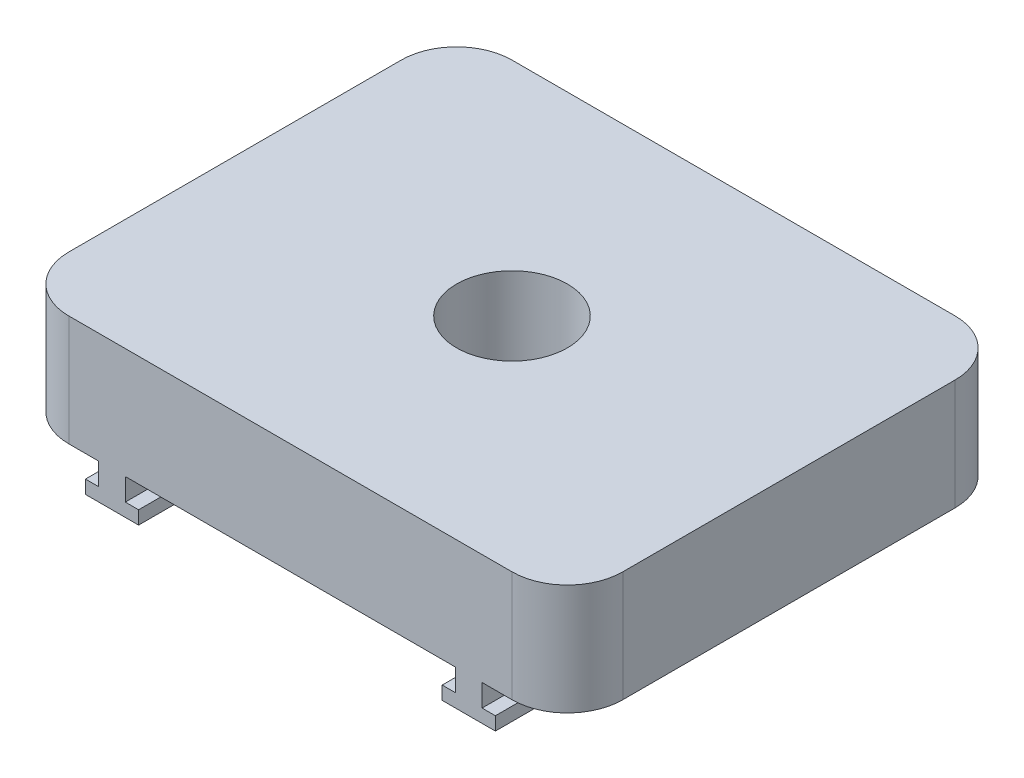
ISO-10303-21;
HEADER;
FILE_DESCRIPTION(('STEP AP214'),'2;1');
FILE_NAME('part.step','',(''),(''),'','','');
FILE_SCHEMA(('AUTOMOTIVE_DESIGN { 1 0 10303 214 1 1 1 1 }'));
ENDSEC;
DATA;
#1=APPLICATION_CONTEXT('core data for automotive mechanical design processes');
#2=APPLICATION_PROTOCOL_DEFINITION('international standard','automotive_design',2000,#1);
#3=PRODUCT_CONTEXT('',#1,'mechanical');
#4=PRODUCT('Part','Part','',(#3));
#5=PRODUCT_RELATED_PRODUCT_CATEGORY('part','',(#4));
#6=PRODUCT_DEFINITION_FORMATION('','',#4);
#7=PRODUCT_DEFINITION_CONTEXT('part definition',#1,'design');
#8=PRODUCT_DEFINITION('design','',#6,#7);
#9=PRODUCT_DEFINITION_SHAPE('','',#8);
#10=(LENGTH_UNIT() NAMED_UNIT(*) SI_UNIT(.MILLI.,.METRE.));
#11=(NAMED_UNIT(*) PLANE_ANGLE_UNIT() SI_UNIT($,.RADIAN.));
#12=(NAMED_UNIT(*) SI_UNIT($,.STERADIAN.) SOLID_ANGLE_UNIT());
#13=UNCERTAINTY_MEASURE_WITH_UNIT(LENGTH_MEASURE(1.E-05),#10,'distance_accuracy_value','');
#14=(GEOMETRIC_REPRESENTATION_CONTEXT(3) GLOBAL_UNCERTAINTY_ASSIGNED_CONTEXT((#13)) GLOBAL_UNIT_ASSIGNED_CONTEXT((#10,
#11,#12)) REPRESENTATION_CONTEXT('',''));
#15=CARTESIAN_POINT('',(0.,0.,0.));
#16=DIRECTION('',(0.,0.,1.));
#17=DIRECTION('',(1.,0.,0.));
#18=AXIS2_PLACEMENT_3D('',#15,#16,#17);
#19=CARTESIAN_POINT('',(0.,-82.,0.));
#20=DIRECTION('',(0.,-1.,0.));
#21=DIRECTION('',(0.,0.,-1.));
#22=AXIS2_PLACEMENT_3D('',#19,#20,#21);
#23=PLANE('',#22);
#24=DIRECTION('',(0.,0.,-1.));
#25=VECTOR('',#24,1.);
#26=CARTESIAN_POINT('',(137.,-82.,200.));
#27=LINE('',#26,#25);
#28=CARTESIAN_POINT('',(137.,-82.,200.));
#29=VERTEX_POINT('',#28);
#30=CARTESIAN_POINT('',(137.,-82.,-200.));
#31=VERTEX_POINT('',#30);
#32=EDGE_CURVE('E194',#29,#31,#27,.T.);
#33=ORIENTED_EDGE('',*,*,#32,.T.);
#34=DIRECTION('',(1.,0.,0.));
#35=VECTOR('',#34,1.);
#36=CARTESIAN_POINT('',(-185.,-82.,-200.));
#37=LINE('',#36,#35);
#38=CARTESIAN_POINT('',(185.,-82.,-200.));
#39=VERTEX_POINT('',#38);
#40=EDGE_CURVE('E322',#31,#39,#37,.T.);
#41=ORIENTED_EDGE('',*,*,#40,.T.);
#42=DIRECTION('',(0.,0.,1.));
#43=VECTOR('',#42,1.);
#44=CARTESIAN_POINT('',(185.,-82.,-200.));
#45=LINE('',#44,#43);
#46=CARTESIAN_POINT('',(185.,-82.,200.));
#47=VERTEX_POINT('',#46);
#48=EDGE_CURVE('E219',#39,#47,#45,.T.);
#49=ORIENTED_EDGE('',*,*,#48,.T.);
#50=DIRECTION('',(-1.,0.,0.));
#51=VECTOR('',#50,1.);
#52=CARTESIAN_POINT('',(185.,-82.,200.));
#53=LINE('',#52,#51);
#54=EDGE_CURVE('E211',#47,#29,#53,.T.);
#55=ORIENTED_EDGE('',*,*,#54,.T.);
#56=EDGE_LOOP('',(#33,#41,#49,#55));
#57=FACE_BOUND('',#56,.T.);
#58=ADVANCED_FACE('F33',(#57),#23,.T.);
#59=CARTESIAN_POINT('',(173.,50.,-200.));
#60=DIRECTION('',(-1.,0.,0.));
#61=DIRECTION('',(0.,-1.,0.));
#62=AXIS2_PLACEMENT_3D('',#59,#60,#61);
#63=PLANE('',#62);
#64=DIRECTION('',(0.,0.,-1.));
#65=VECTOR('',#64,1.);
#66=CARTESIAN_POINT('',(173.,-50.,-200.));
#67=LINE('',#66,#65);
#68=CARTESIAN_POINT('',(173.,-50.,200.));
#69=VERTEX_POINT('',#68);
#70=CARTESIAN_POINT('',(173.,-50.,-200.));
#71=VERTEX_POINT('',#70);
#72=EDGE_CURVE('E355',#69,#71,#67,.T.);
#73=ORIENTED_EDGE('',*,*,#72,.F.);
#74=DIRECTION('',(0.,-1.,0.));
#75=VECTOR('',#74,1.);
#76=CARTESIAN_POINT('',(173.,50.,200.));
#77=LINE('',#76,#75);
#78=CARTESIAN_POINT('',(173.,-69.999999988,200.));
#79=VERTEX_POINT('',#78);
#80=EDGE_CURVE('E338',#69,#79,#77,.T.);
#81=ORIENTED_EDGE('',*,*,#80,.T.);
#82=DIRECTION('',(0.,0.,1.));
#83=VECTOR('',#82,1.);
#84=CARTESIAN_POINT('',(173.,-69.999999988,-200.));
#85=LINE('',#84,#83);
#86=CARTESIAN_POINT('',(173.,-69.999999988,-200.));
#87=VERTEX_POINT('',#86);
#88=EDGE_CURVE('E348',#87,#79,#85,.T.);
#89=ORIENTED_EDGE('',*,*,#88,.F.);
#90=DIRECTION('',(0.,-1.,0.));
#91=VECTOR('',#90,1.);
#92=CARTESIAN_POINT('',(173.,50.,-200.));
#93=LINE('',#92,#91);
#94=EDGE_CURVE('E341',#71,#87,#93,.T.);
#95=ORIENTED_EDGE('',*,*,#94,.F.);
#96=EDGE_LOOP('',(#73,#81,#89,#95));
#97=FACE_BOUND('',#96,.T.);
#98=ADVANCED_FACE('F474',(#97),#63,.F.);
#99=CARTESIAN_POINT('',(-173.,-69.999999988,-200.));
#100=DIRECTION('',(1.,0.,0.));
#101=DIRECTION('',(0.,1.,0.));
#102=AXIS2_PLACEMENT_3D('',#99,#100,#101);
#103=PLANE('',#102);
#104=DIRECTION('',(0.,0.,1.));
#105=VECTOR('',#104,1.);
#106=CARTESIAN_POINT('',(-173.,-50.,200.));
#107=LINE('',#106,#105);
#108=CARTESIAN_POINT('',(-173.,-50.,-200.));
#109=VERTEX_POINT('',#108);
#110=CARTESIAN_POINT('',(-173.,-50.,200.));
#111=VERTEX_POINT('',#110);
#112=EDGE_CURVE('E301',#109,#111,#107,.T.);
#113=ORIENTED_EDGE('',*,*,#112,.F.);
#114=DIRECTION('',(0.,1.,0.));
#115=VECTOR('',#114,1.);
#116=CARTESIAN_POINT('',(-173.,-69.999999988,-200.));
#117=LINE('',#116,#115);
#118=CARTESIAN_POINT('',(-173.,-69.999999988,-200.));
#119=VERTEX_POINT('',#118);
#120=EDGE_CURVE('E284',#119,#109,#117,.T.);
#121=ORIENTED_EDGE('',*,*,#120,.F.);
#122=DIRECTION('',(0.,0.,1.));
#123=VECTOR('',#122,1.);
#124=CARTESIAN_POINT('',(-173.,-69.999999988,-200.));
#125=LINE('',#124,#123);
#126=CARTESIAN_POINT('',(-173.,-69.999999988,200.));
#127=VERTEX_POINT('',#126);
#128=EDGE_CURVE('E316',#119,#127,#125,.T.);
#129=ORIENTED_EDGE('',*,*,#128,.T.);
#130=DIRECTION('',(0.,1.,0.));
#131=VECTOR('',#130,1.);
#132=CARTESIAN_POINT('',(-173.,-69.999999988,200.));
#133=LINE('',#132,#131);
#134=EDGE_CURVE('E309',#127,#111,#133,.T.);
#135=ORIENTED_EDGE('',*,*,#134,.T.);
#136=EDGE_LOOP('',(#113,#121,#129,#135));
#137=FACE_BOUND('',#136,.T.);
#138=ADVANCED_FACE('F452',(#137),#103,.F.);
#139=CARTESIAN_POINT('',(-185.,50.,200.));
#140=DIRECTION('',(-1.,0.,0.));
#141=DIRECTION('',(0.,0.,1.));
#142=AXIS2_PLACEMENT_3D('',#139,#140,#141);
#143=PLANE('',#142);
#144=DIRECTION('',(0.,0.,1.));
#145=VECTOR('',#144,1.);
#146=CARTESIAN_POINT('',(-185.,-69.999999988,-200.));
#147=LINE('',#146,#145);
#148=CARTESIAN_POINT('',(-185.,-69.999999988,-200.));
#149=VERTEX_POINT('',#148);
#150=CARTESIAN_POINT('',(-185.,-69.999999988,200.));
#151=VERTEX_POINT('',#150);
#152=EDGE_CURVE('E311',#149,#151,#147,.T.);
#153=ORIENTED_EDGE('',*,*,#152,.F.);
#154=DIRECTION('',(0.,-1.,0.));
#155=VECTOR('',#154,1.);
#156=CARTESIAN_POINT('',(-185.,50.,-200.));
#157=LINE('',#156,#155);
#158=CARTESIAN_POINT('',(-185.,-82.,-200.));
#159=VERTEX_POINT('',#158);
#160=EDGE_CURVE('E238',#149,#159,#157,.T.);
#161=ORIENTED_EDGE('',*,*,#160,.T.);
#162=DIRECTION('',(0.,0.,-1.));
#163=VECTOR('',#162,1.);
#164=CARTESIAN_POINT('',(-185.,-82.,200.));
#165=LINE('',#164,#163);
#166=CARTESIAN_POINT('',(-185.,-82.,200.));
#167=VERTEX_POINT('',#166);
#168=EDGE_CURVE('E318',#167,#159,#165,.T.);
#169=ORIENTED_EDGE('',*,*,#168,.F.);
#170=DIRECTION('',(0.,-1.,0.));
#171=VECTOR('',#170,1.);
#172=CARTESIAN_POINT('',(-185.,50.,200.));
#173=LINE('',#172,#171);
#174=EDGE_CURVE('E229',#151,#167,#173,.T.);
#175=ORIENTED_EDGE('',*,*,#174,.F.);
#176=EDGE_LOOP('',(#153,#161,#169,#175));
#177=FACE_BOUND('',#176,.T.);
#178=ADVANCED_FACE('F447',(#177),#143,.T.);
#179=CARTESIAN_POINT('',(185.,50.,200.));
#180=DIRECTION('',(0.,0.,1.));
#181=DIRECTION('',(1.,0.,0.));
#182=AXIS2_PLACEMENT_3D('',#179,#180,#181);
#183=PLANE('',#182);
#184=DIRECTION('',(-1.,0.,0.));
#185=VECTOR('',#184,1.);
#186=CARTESIAN_POINT('',(250.,-50.,200.));
#187=LINE('',#186,#185);
#188=CARTESIAN_POINT('',(200.,-50.,200.));
#189=VERTEX_POINT('',#188);
#190=EDGE_CURVE('E344',#189,#69,#187,.T.);
#191=ORIENTED_EDGE('',*,*,#190,.F.);
#192=DIRECTION('',(0.,-1.,0.));
#193=VECTOR('',#192,1.);
#194=CARTESIAN_POINT('',(200.,50.,200.));
#195=LINE('',#194,#193);
#196=CARTESIAN_POINT('',(200.,50.,200.));
#197=VERTEX_POINT('',#196);
#198=EDGE_CURVE('E11',#189,#197,#195,.F.);
#199=ORIENTED_EDGE('',*,*,#198,.T.);
#200=DIRECTION('',(-1.,0.,0.));
#201=VECTOR('',#200,1.);
#202=CARTESIAN_POINT('',(185.,50.,200.));
#203=LINE('',#202,#201);
#204=CARTESIAN_POINT('',(-200.,50.,200.));
#205=VERTEX_POINT('',#204);
#206=EDGE_CURVE('E224',#197,#205,#203,.T.);
#207=ORIENTED_EDGE('',*,*,#206,.T.);
#208=DIRECTION('',(0.,1.,0.));
#209=VECTOR('',#208,1.);
#210=CARTESIAN_POINT('',(-200.,-50.,200.));
#211=LINE('',#210,#209);
#212=CARTESIAN_POINT('',(-200.,-50.,200.));
#213=VERTEX_POINT('',#212);
#214=EDGE_CURVE('E41',#205,#213,#211,.F.);
#215=ORIENTED_EDGE('',*,*,#214,.T.);
#216=DIRECTION('',(1.,0.,0.));
#217=VECTOR('',#216,1.);
#218=CARTESIAN_POINT('',(-250.,-50.,200.));
#219=LINE('',#218,#217);
#220=EDGE_CURVE('E286',#213,#111,#219,.T.);
#221=ORIENTED_EDGE('',*,*,#220,.T.);
#222=ORIENTED_EDGE('',*,*,#134,.F.);
#223=DIRECTION('',(1.,0.,0.));
#224=VECTOR('',#223,1.);
#225=CARTESIAN_POINT('',(-185.,-69.999999988,200.));
#226=LINE('',#225,#224);
#227=EDGE_CURVE('E285',#151,#127,#226,.T.);
#228=ORIENTED_EDGE('',*,*,#227,.F.);
#229=ORIENTED_EDGE('',*,*,#174,.T.);
#230=CARTESIAN_POINT('',(-137.,-82.,200.));
#231=VERTEX_POINT('',#230);
#232=EDGE_CURVE('E221',#231,#167,#53,.T.);
#233=ORIENTED_EDGE('',*,*,#232,.F.);
#234=DIRECTION('',(0.,1.,0.));
#235=VECTOR('',#234,1.);
#236=CARTESIAN_POINT('',(-137.,-82.,200.));
#237=LINE('',#236,#235);
#238=CARTESIAN_POINT('',(-137.,-69.999999997,200.));
#239=VERTEX_POINT('',#238);
#240=EDGE_CURVE('E214',#231,#239,#237,.T.);
#241=ORIENTED_EDGE('',*,*,#240,.T.);
#242=DIRECTION('',(-1.,0.,0.));
#243=VECTOR('',#242,1.);
#244=CARTESIAN_POINT('',(-137.,-69.999999997,200.));
#245=LINE('',#244,#243);
#246=CARTESIAN_POINT('',(-149.,-69.999999997,200.));
#247=VERTEX_POINT('',#246);
#248=EDGE_CURVE('E404',#239,#247,#245,.T.);
#249=ORIENTED_EDGE('',*,*,#248,.T.);
#250=DIRECTION('',(0.,1.,0.));
#251=VECTOR('',#250,1.);
#252=CARTESIAN_POINT('',(-149.,-69.999999997,200.));
#253=LINE('',#252,#251);
#254=CARTESIAN_POINT('',(-149.,-50.,200.));
#255=VERTEX_POINT('',#254);
#256=EDGE_CURVE('E401',#247,#255,#253,.T.);
#257=ORIENTED_EDGE('',*,*,#256,.T.);
#258=DIRECTION('',(1.,0.,0.));
#259=VECTOR('',#258,1.);
#260=CARTESIAN_POINT('',(-149.,-50.,200.));
#261=LINE('',#260,#259);
#262=CARTESIAN_POINT('',(149.,-50.,200.));
#263=VERTEX_POINT('',#262);
#264=EDGE_CURVE('E398',#255,#263,#261,.T.);
#265=ORIENTED_EDGE('',*,*,#264,.T.);
#266=DIRECTION('',(0.,-1.,0.));
#267=VECTOR('',#266,1.);
#268=CARTESIAN_POINT('',(149.,-50.,200.));
#269=LINE('',#268,#267);
#270=CARTESIAN_POINT('',(149.,-69.999999997,200.));
#271=VERTEX_POINT('',#270);
#272=EDGE_CURVE('E396',#263,#271,#269,.T.);
#273=ORIENTED_EDGE('',*,*,#272,.T.);
#274=DIRECTION('',(-1.,0.,0.));
#275=VECTOR('',#274,1.);
#276=CARTESIAN_POINT('',(149.,-69.999999997,200.));
#277=LINE('',#276,#275);
#278=CARTESIAN_POINT('',(137.,-69.999999997,200.));
#279=VERTEX_POINT('',#278);
#280=EDGE_CURVE('E205',#271,#279,#277,.T.);
#281=ORIENTED_EDGE('',*,*,#280,.T.);
#282=DIRECTION('',(0.,-1.,0.));
#283=VECTOR('',#282,1.);
#284=CARTESIAN_POINT('',(137.,-69.999999997,200.));
#285=LINE('',#284,#283);
#286=EDGE_CURVE('E197',#279,#29,#285,.T.);
#287=ORIENTED_EDGE('',*,*,#286,.T.);
#288=ORIENTED_EDGE('',*,*,#54,.F.);
#289=DIRECTION('',(0.,-1.,0.));
#290=VECTOR('',#289,1.);
#291=CARTESIAN_POINT('',(185.,50.,200.));
#292=LINE('',#291,#290);
#293=CARTESIAN_POINT('',(185.,-69.999999988,200.));
#294=VERTEX_POINT('',#293);
#295=EDGE_CURVE('E233',#294,#47,#292,.T.);
#296=ORIENTED_EDGE('',*,*,#295,.F.);
#297=DIRECTION('',(1.,0.,0.));
#298=VECTOR('',#297,1.);
#299=CARTESIAN_POINT('',(173.,-69.999999988,200.));
#300=LINE('',#299,#298);
#301=EDGE_CURVE('E337',#79,#294,#300,.T.);
#302=ORIENTED_EDGE('',*,*,#301,.F.);
#303=ORIENTED_EDGE('',*,*,#80,.F.);
#304=EDGE_LOOP('',(#191,#199,#207,#215,#221,#222,#228,#229,#233,#241,#249,#257,#265,#273,#281,
#287,#288,#296,#302,#303));
#305=FACE_BOUND('',#304,.T.);
#306=ADVANCED_FACE('F209',(#305),#183,.T.);
#307=CARTESIAN_POINT('',(185.,50.,-200.));
#308=DIRECTION('',(1.,0.,0.));
#309=DIRECTION('',(0.,0.,-1.));
#310=AXIS2_PLACEMENT_3D('',#307,#308,#309);
#311=PLANE('',#310);
#312=DIRECTION('',(0.,0.,1.));
#313=VECTOR('',#312,1.);
#314=CARTESIAN_POINT('',(185.,-69.999999988,-200.));
#315=LINE('',#314,#313);
#316=CARTESIAN_POINT('',(185.,-69.999999988,-200.));
#317=VERTEX_POINT('',#316);
#318=EDGE_CURVE('E305',#317,#294,#315,.T.);
#319=ORIENTED_EDGE('',*,*,#318,.T.);
#320=ORIENTED_EDGE('',*,*,#295,.T.);
#321=ORIENTED_EDGE('',*,*,#48,.F.);
#322=DIRECTION('',(0.,-1.,0.));
#323=VECTOR('',#322,1.);
#324=CARTESIAN_POINT('',(185.,50.,-200.));
#325=LINE('',#324,#323);
#326=EDGE_CURVE('E235',#317,#39,#325,.T.);
#327=ORIENTED_EDGE('',*,*,#326,.F.);
#328=EDGE_LOOP('',(#319,#320,#321,#327));
#329=FACE_BOUND('',#328,.T.);
#330=ADVANCED_FACE('F334',(#329),#311,.T.);
#331=CARTESIAN_POINT('',(-185.,50.,-200.));
#332=DIRECTION('',(0.,0.,-1.));
#333=DIRECTION('',(-1.,0.,0.));
#334=AXIS2_PLACEMENT_3D('',#331,#332,#333);
#335=PLANE('',#334);
#336=DIRECTION('',(1.,0.,0.));
#337=VECTOR('',#336,1.);
#338=CARTESIAN_POINT('',(-185.,50.,-200.));
#339=LINE('',#338,#337);
#340=CARTESIAN_POINT('',(-200.,50.,-200.));
#341=VERTEX_POINT('',#340);
#342=CARTESIAN_POINT('',(200.,50.,-200.));
#343=VERTEX_POINT('',#342);
#344=EDGE_CURVE('E220',#341,#343,#339,.T.);
#345=ORIENTED_EDGE('',*,*,#344,.T.);
#346=DIRECTION('',(0.,1.,0.));
#347=VECTOR('',#346,1.);
#348=CARTESIAN_POINT('',(200.,-50.,-200.));
#349=LINE('',#348,#347);
#350=CARTESIAN_POINT('',(200.,-50.,-200.));
#351=VERTEX_POINT('',#350);
#352=EDGE_CURVE('E255',#343,#351,#349,.F.);
#353=ORIENTED_EDGE('',*,*,#352,.T.);
#354=DIRECTION('',(-1.,0.,0.));
#355=VECTOR('',#354,1.);
#356=CARTESIAN_POINT('',(250.,-50.,-200.));
#357=LINE('',#356,#355);
#358=EDGE_CURVE('E352',#351,#71,#357,.T.);
#359=ORIENTED_EDGE('',*,*,#358,.T.);
#360=ORIENTED_EDGE('',*,*,#94,.T.);
#361=DIRECTION('',(1.,0.,0.));
#362=VECTOR('',#361,1.);
#363=CARTESIAN_POINT('',(173.,-69.999999988,-200.));
#364=LINE('',#363,#362);
#365=EDGE_CURVE('E331',#87,#317,#364,.T.);
#366=ORIENTED_EDGE('',*,*,#365,.T.);
#367=ORIENTED_EDGE('',*,*,#326,.T.);
#368=ORIENTED_EDGE('',*,*,#40,.F.);
#369=DIRECTION('',(0.,-1.,0.));
#370=VECTOR('',#369,1.);
#371=CARTESIAN_POINT('',(137.,-69.999999997,-200.));
#372=LINE('',#371,#370);
#373=CARTESIAN_POINT('',(137.,-69.999999997,-200.));
#374=VERTEX_POINT('',#373);
#375=EDGE_CURVE('E200',#374,#31,#372,.T.);
#376=ORIENTED_EDGE('',*,*,#375,.F.);
#377=DIRECTION('',(-1.,0.,0.));
#378=VECTOR('',#377,1.);
#379=CARTESIAN_POINT('',(149.,-69.999999997,-200.));
#380=LINE('',#379,#378);
#381=CARTESIAN_POINT('',(149.,-69.999999997,-200.));
#382=VERTEX_POINT('',#381);
#383=EDGE_CURVE('E215',#382,#374,#380,.T.);
#384=ORIENTED_EDGE('',*,*,#383,.F.);
#385=DIRECTION('',(0.,-1.,0.));
#386=VECTOR('',#385,1.);
#387=CARTESIAN_POINT('',(149.,-50.,-200.));
#388=LINE('',#387,#386);
#389=CARTESIAN_POINT('',(149.,-50.,-200.));
#390=VERTEX_POINT('',#389);
#391=EDGE_CURVE('E378',#390,#382,#388,.T.);
#392=ORIENTED_EDGE('',*,*,#391,.F.);
#393=DIRECTION('',(1.,0.,0.));
#394=VECTOR('',#393,1.);
#395=CARTESIAN_POINT('',(-149.,-50.,-200.));
#396=LINE('',#395,#394);
#397=CARTESIAN_POINT('',(-149.,-50.,-200.));
#398=VERTEX_POINT('',#397);
#399=EDGE_CURVE('E381',#398,#390,#396,.T.);
#400=ORIENTED_EDGE('',*,*,#399,.F.);
#401=DIRECTION('',(0.,1.,0.));
#402=VECTOR('',#401,1.);
#403=CARTESIAN_POINT('',(-149.,-69.999999997,-200.));
#404=LINE('',#403,#402);
#405=CARTESIAN_POINT('',(-149.,-69.999999997,-200.));
#406=VERTEX_POINT('',#405);
#407=EDGE_CURVE('E384',#406,#398,#404,.T.);
#408=ORIENTED_EDGE('',*,*,#407,.F.);
#409=DIRECTION('',(-1.,0.,0.));
#410=VECTOR('',#409,1.);
#411=CARTESIAN_POINT('',(-137.,-69.999999997,-200.));
#412=LINE('',#411,#410);
#413=CARTESIAN_POINT('',(-137.,-69.999999997,-200.));
#414=VERTEX_POINT('',#413);
#415=EDGE_CURVE('E387',#414,#406,#412,.T.);
#416=ORIENTED_EDGE('',*,*,#415,.F.);
#417=DIRECTION('',(0.,1.,0.));
#418=VECTOR('',#417,1.);
#419=CARTESIAN_POINT('',(-137.,-82.,-200.));
#420=LINE('',#419,#418);
#421=CARTESIAN_POINT('',(-137.,-82.,-200.));
#422=VERTEX_POINT('',#421);
#423=EDGE_CURVE('E390',#422,#414,#420,.T.);
#424=ORIENTED_EDGE('',*,*,#423,.F.);
#425=EDGE_CURVE('E323',#159,#422,#37,.T.);
#426=ORIENTED_EDGE('',*,*,#425,.F.);
#427=ORIENTED_EDGE('',*,*,#160,.F.);
#428=DIRECTION('',(1.,0.,0.));
#429=VECTOR('',#428,1.);
#430=CARTESIAN_POINT('',(-185.,-69.999999988,-200.));
#431=LINE('',#430,#429);
#432=EDGE_CURVE('E307',#149,#119,#431,.T.);
#433=ORIENTED_EDGE('',*,*,#432,.T.);
#434=ORIENTED_EDGE('',*,*,#120,.T.);
#435=DIRECTION('',(1.,0.,0.));
#436=VECTOR('',#435,1.);
#437=CARTESIAN_POINT('',(-250.,-50.,-200.));
#438=LINE('',#437,#436);
#439=CARTESIAN_POINT('',(-200.,-50.,-200.));
#440=VERTEX_POINT('',#439);
#441=EDGE_CURVE('E272',#440,#109,#438,.T.);
#442=ORIENTED_EDGE('',*,*,#441,.F.);
#443=DIRECTION('',(0.,-1.,0.));
#444=VECTOR('',#443,1.);
#445=CARTESIAN_POINT('',(-200.,50.,-200.));
#446=LINE('',#445,#444);
#447=EDGE_CURVE('E253',#440,#341,#446,.F.);
#448=ORIENTED_EDGE('',*,*,#447,.T.);
#449=EDGE_LOOP('',(#345,#353,#359,#360,#366,#367,#368,#376,#384,#392,#400,#408,#416,#424,#426,
#427,#433,#434,#442,#448));
#450=FACE_BOUND('',#449,.T.);
#451=ADVANCED_FACE('F280',(#450),#335,.T.);
#452=CARTESIAN_POINT('',(0.,50.,0.));
#453=DIRECTION('',(0.,-1.,0.));
#454=DIRECTION('',(0.,0.,-1.));
#455=AXIS2_PLACEMENT_3D('',#452,#453,#454);
#456=PLANE('',#455);
#457=CARTESIAN_POINT('',(0.,50.,0.));
#458=DIRECTION('',(0.,-1.,0.));
#459=DIRECTION('',(0.,0.,-1.));
#460=AXIS2_PLACEMENT_3D('',#457,#458,#459);
#461=CIRCLE('',#460,50.);
#462=CARTESIAN_POINT('',(0.,50.,-50.));
#463=VERTEX_POINT('',#462);
#464=EDGE_CURVE('E394',#463,#463,#461,.T.);
#465=ORIENTED_EDGE('',*,*,#464,.T.);
#466=EDGE_LOOP('',(#465));
#467=FACE_BOUND('',#466,.T.);
#468=DIRECTION('',(0.,0.,1.));
#469=VECTOR('',#468,1.);
#470=CARTESIAN_POINT('',(250.,50.,200.));
#471=LINE('',#470,#469);
#472=CARTESIAN_POINT('',(250.,50.,-150.));
#473=VERTEX_POINT('',#472);
#474=CARTESIAN_POINT('',(250.,50.,150.));
#475=VERTEX_POINT('',#474);
#476=EDGE_CURVE('E358',#473,#475,#471,.T.);
#477=ORIENTED_EDGE('',*,*,#476,.F.);
#478=CARTESIAN_POINT('',(200.,50.,-150.));
#479=DIRECTION('',(0.,-1.,0.));
#480=DIRECTION('',(0.,0.,-1.));
#481=AXIS2_PLACEMENT_3D('',#478,#479,#480);
#482=CIRCLE('',#481,50.);
#483=EDGE_CURVE('E251',#473,#343,#482,.F.);
#484=ORIENTED_EDGE('',*,*,#483,.T.);
#485=ORIENTED_EDGE('',*,*,#344,.F.);
#486=CARTESIAN_POINT('',(-200.,50.,-150.));
#487=DIRECTION('',(0.,-1.,0.));
#488=DIRECTION('',(0.,0.,-1.));
#489=AXIS2_PLACEMENT_3D('',#486,#487,#488);
#490=CIRCLE('',#489,50.);
#491=CARTESIAN_POINT('',(-250.,50.,-150.));
#492=VERTEX_POINT('',#491);
#493=EDGE_CURVE('E249',#341,#492,#490,.F.);
#494=ORIENTED_EDGE('',*,*,#493,.T.);
#495=DIRECTION('',(0.,0.,-1.));
#496=VECTOR('',#495,1.);
#497=CARTESIAN_POINT('',(-250.,50.,-200.));
#498=LINE('',#497,#496);
#499=CARTESIAN_POINT('',(-250.,50.,150.));
#500=VERTEX_POINT('',#499);
#501=EDGE_CURVE('E295',#500,#492,#498,.T.);
#502=ORIENTED_EDGE('',*,*,#501,.F.);
#503=CARTESIAN_POINT('',(-200.,50.,150.));
#504=DIRECTION('',(0.,-1.,0.));
#505=DIRECTION('',(0.,0.,-1.));
#506=AXIS2_PLACEMENT_3D('',#503,#504,#505);
#507=CIRCLE('',#506,50.);
#508=EDGE_CURVE('E245',#500,#205,#507,.F.);
#509=ORIENTED_EDGE('',*,*,#508,.T.);
#510=ORIENTED_EDGE('',*,*,#206,.F.);
#511=CARTESIAN_POINT('',(200.,50.,150.));
#512=DIRECTION('',(0.,-1.,0.));
#513=DIRECTION('',(0.,0.,-1.));
#514=AXIS2_PLACEMENT_3D('',#511,#512,#513);
#515=CIRCLE('',#514,50.);
#516=EDGE_CURVE('E247',#197,#475,#515,.F.);
#517=ORIENTED_EDGE('',*,*,#516,.T.);
#518=EDGE_LOOP('',(#477,#484,#485,#494,#502,#509,#510,#517));
#519=FACE_BOUND('',#518,.T.);
#520=ADVANCED_FACE('F294',(#467,#519),#456,.F.);
#521=DIRECTION('',(0.,0.,-1.));
#522=VECTOR('',#521,1.);
#523=CARTESIAN_POINT('',(-137.,-82.,200.));
#524=LINE('',#523,#522);
#525=EDGE_CURVE('E204',#231,#422,#524,.T.);
#526=ORIENTED_EDGE('',*,*,#525,.F.);
#527=ORIENTED_EDGE('',*,*,#232,.T.);
#528=ORIENTED_EDGE('',*,*,#168,.T.);
#529=ORIENTED_EDGE('',*,*,#425,.T.);
#530=EDGE_LOOP('',(#526,#527,#528,#529));
#531=FACE_BOUND('',#530,.T.);
#532=ADVANCED_FACE('F440',(#531),#23,.T.);
#533=CARTESIAN_POINT('',(-185.,-69.999999988,-200.));
#534=DIRECTION('',(0.,-1.,0.));
#535=DIRECTION('',(0.,0.,-1.));
#536=AXIS2_PLACEMENT_3D('',#533,#534,#535);
#537=PLANE('',#536);
#538=ORIENTED_EDGE('',*,*,#227,.T.);
#539=ORIENTED_EDGE('',*,*,#128,.F.);
#540=ORIENTED_EDGE('',*,*,#432,.F.);
#541=ORIENTED_EDGE('',*,*,#152,.T.);
#542=EDGE_LOOP('',(#538,#539,#540,#541));
#543=FACE_BOUND('',#542,.T.);
#544=ADVANCED_FACE('F450',(#543),#537,.F.);
#545=CARTESIAN_POINT('',(-250.,-50.,200.));
#546=DIRECTION('',(0.,1.,0.));
#547=DIRECTION('',(-1.,0.,0.));
#548=AXIS2_PLACEMENT_3D('',#545,#546,#547);
#549=PLANE('',#548);
#550=DIRECTION('',(0.,0.,1.));
#551=VECTOR('',#550,1.);
#552=CARTESIAN_POINT('',(-250.,-50.,200.));
#553=LINE('',#552,#551);
#554=CARTESIAN_POINT('',(-250.,-50.,-150.));
#555=VERTEX_POINT('',#554);
#556=CARTESIAN_POINT('',(-250.,-50.,150.));
#557=VERTEX_POINT('',#556);
#558=EDGE_CURVE('E274',#555,#557,#553,.T.);
#559=ORIENTED_EDGE('',*,*,#558,.F.);
#560=CARTESIAN_POINT('',(-200.,-50.,-150.));
#561=DIRECTION('',(0.,1.,0.));
#562=DIRECTION('',(-1.,0.,0.));
#563=AXIS2_PLACEMENT_3D('',#560,#561,#562);
#564=CIRCLE('',#563,50.);
#565=EDGE_CURVE('E268',#555,#440,#564,.F.);
#566=ORIENTED_EDGE('',*,*,#565,.T.);
#567=ORIENTED_EDGE('',*,*,#441,.T.);
#568=ORIENTED_EDGE('',*,*,#112,.T.);
#569=ORIENTED_EDGE('',*,*,#220,.F.);
#570=CARTESIAN_POINT('',(-200.,-50.,150.));
#571=DIRECTION('',(0.,1.,0.));
#572=DIRECTION('',(-1.,0.,0.));
#573=AXIS2_PLACEMENT_3D('',#570,#571,#572);
#574=CIRCLE('',#573,50.);
#575=EDGE_CURVE('E54',#213,#557,#574,.F.);
#576=ORIENTED_EDGE('',*,*,#575,.T.);
#577=EDGE_LOOP('',(#559,#566,#567,#568,#569,#576));
#578=FACE_BOUND('',#577,.T.);
#579=ADVANCED_FACE('F270',(#578),#549,.F.);
#580=CARTESIAN_POINT('',(-250.,0.,0.));
#581=DIRECTION('',(1.,0.,0.));
#582=DIRECTION('',(0.,0.,-1.));
#583=AXIS2_PLACEMENT_3D('',#580,#581,#582);
#584=PLANE('',#583);
#585=ORIENTED_EDGE('',*,*,#501,.T.);
#586=DIRECTION('',(0.,-1.,0.));
#587=VECTOR('',#586,1.);
#588=CARTESIAN_POINT('',(-250.,-50.,-150.));
#589=LINE('',#588,#587);
#590=EDGE_CURVE('E264',#492,#555,#589,.T.);
#591=ORIENTED_EDGE('',*,*,#590,.T.);
#592=ORIENTED_EDGE('',*,*,#558,.T.);
#593=DIRECTION('',(0.,1.,0.));
#594=VECTOR('',#593,1.);
#595=CARTESIAN_POINT('',(-250.,50.,150.));
#596=LINE('',#595,#594);
#597=EDGE_CURVE('E261',#557,#500,#596,.T.);
#598=ORIENTED_EDGE('',*,*,#597,.T.);
#599=EDGE_LOOP('',(#585,#591,#592,#598));
#600=FACE_BOUND('',#599,.T.);
#601=ADVANCED_FACE('F297',(#600),#584,.F.);
#602=CARTESIAN_POINT('',(173.,-69.999999988,-200.));
#603=DIRECTION('',(0.,-1.,0.));
#604=DIRECTION('',(0.,0.,-1.));
#605=AXIS2_PLACEMENT_3D('',#602,#603,#604);
#606=PLANE('',#605);
#607=ORIENTED_EDGE('',*,*,#301,.T.);
#608=ORIENTED_EDGE('',*,*,#318,.F.);
#609=ORIENTED_EDGE('',*,*,#365,.F.);
#610=ORIENTED_EDGE('',*,*,#88,.T.);
#611=EDGE_LOOP('',(#607,#608,#609,#610));
#612=FACE_BOUND('',#611,.T.);
#613=ADVANCED_FACE('F475',(#612),#606,.F.);
#614=CARTESIAN_POINT('',(250.,-50.,-200.));
#615=DIRECTION('',(0.,1.,0.));
#616=DIRECTION('',(-1.,0.,0.));
#617=AXIS2_PLACEMENT_3D('',#614,#615,#616);
#618=PLANE('',#617);
#619=ORIENTED_EDGE('',*,*,#358,.F.);
#620=CARTESIAN_POINT('',(200.,-50.,-150.));
#621=DIRECTION('',(0.,1.,0.));
#622=DIRECTION('',(-1.,0.,0.));
#623=AXIS2_PLACEMENT_3D('',#620,#621,#622);
#624=CIRCLE('',#623,50.);
#625=CARTESIAN_POINT('',(250.,-50.,-150.));
#626=VERTEX_POINT('',#625);
#627=EDGE_CURVE('E259',#351,#626,#624,.F.);
#628=ORIENTED_EDGE('',*,*,#627,.T.);
#629=DIRECTION('',(0.,0.,-1.));
#630=VECTOR('',#629,1.);
#631=CARTESIAN_POINT('',(250.,-50.,-200.));
#632=LINE('',#631,#630);
#633=CARTESIAN_POINT('',(250.,-50.,150.));
#634=VERTEX_POINT('',#633);
#635=EDGE_CURVE('E354',#634,#626,#632,.T.);
#636=ORIENTED_EDGE('',*,*,#635,.F.);
#637=CARTESIAN_POINT('',(200.,-50.,150.));
#638=DIRECTION('',(0.,1.,0.));
#639=DIRECTION('',(-1.,0.,0.));
#640=AXIS2_PLACEMENT_3D('',#637,#638,#639);
#641=CIRCLE('',#640,50.);
#642=EDGE_CURVE('E257',#634,#189,#641,.F.);
#643=ORIENTED_EDGE('',*,*,#642,.T.);
#644=ORIENTED_EDGE('',*,*,#190,.T.);
#645=ORIENTED_EDGE('',*,*,#72,.T.);
#646=EDGE_LOOP('',(#619,#628,#636,#643,#644,#645));
#647=FACE_BOUND('',#646,.T.);
#648=ADVANCED_FACE('F471',(#647),#618,.F.);
#649=CARTESIAN_POINT('',(250.,0.,0.));
#650=DIRECTION('',(-1.,0.,0.));
#651=DIRECTION('',(0.,0.,1.));
#652=AXIS2_PLACEMENT_3D('',#649,#650,#651);
#653=PLANE('',#652);
#654=ORIENTED_EDGE('',*,*,#635,.T.);
#655=DIRECTION('',(0.,1.,0.));
#656=VECTOR('',#655,1.);
#657=CARTESIAN_POINT('',(250.,50.,-150.));
#658=LINE('',#657,#656);
#659=EDGE_CURVE('E242',#626,#473,#658,.T.);
#660=ORIENTED_EDGE('',*,*,#659,.T.);
#661=ORIENTED_EDGE('',*,*,#476,.T.);
#662=DIRECTION('',(0.,-1.,0.));
#663=VECTOR('',#662,1.);
#664=CARTESIAN_POINT('',(250.,-50.,150.));
#665=LINE('',#664,#663);
#666=EDGE_CURVE('E232',#475,#634,#665,.T.);
#667=ORIENTED_EDGE('',*,*,#666,.T.);
#668=EDGE_LOOP('',(#654,#660,#661,#667));
#669=FACE_BOUND('',#668,.T.);
#670=ADVANCED_FACE('F461',(#669),#653,.F.);
#671=CARTESIAN_POINT('',(137.,-69.999999997,200.));
#672=DIRECTION('',(1.,0.,0.));
#673=DIRECTION('',(0.,0.,-1.));
#674=AXIS2_PLACEMENT_3D('',#671,#672,#673);
#675=PLANE('',#674);
#676=ORIENTED_EDGE('',*,*,#375,.T.);
#677=ORIENTED_EDGE('',*,*,#32,.F.);
#678=ORIENTED_EDGE('',*,*,#286,.F.);
#679=DIRECTION('',(0.,0.,-1.));
#680=VECTOR('',#679,1.);
#681=CARTESIAN_POINT('',(137.,-69.999999997,200.));
#682=LINE('',#681,#680);
#683=EDGE_CURVE('E359',#279,#374,#682,.T.);
#684=ORIENTED_EDGE('',*,*,#683,.T.);
#685=EDGE_LOOP('',(#676,#677,#678,#684));
#686=FACE_BOUND('',#685,.T.);
#687=ADVANCED_FACE('F196',(#686),#675,.F.);
#688=CARTESIAN_POINT('',(149.,-69.999999997,200.));
#689=DIRECTION('',(0.,-1.,0.));
#690=DIRECTION('',(0.,0.,-1.));
#691=AXIS2_PLACEMENT_3D('',#688,#689,#690);
#692=PLANE('',#691);
#693=ORIENTED_EDGE('',*,*,#383,.T.);
#694=ORIENTED_EDGE('',*,*,#683,.F.);
#695=ORIENTED_EDGE('',*,*,#280,.F.);
#696=DIRECTION('',(0.,0.,-1.));
#697=VECTOR('',#696,1.);
#698=CARTESIAN_POINT('',(149.,-69.999999997,200.));
#699=LINE('',#698,#697);
#700=EDGE_CURVE('E373',#271,#382,#699,.T.);
#701=ORIENTED_EDGE('',*,*,#700,.T.);
#702=EDGE_LOOP('',(#693,#694,#695,#701));
#703=FACE_BOUND('',#702,.T.);
#704=ADVANCED_FACE('F637',(#703),#692,.F.);
#705=CARTESIAN_POINT('',(149.,-50.,200.));
#706=DIRECTION('',(1.,0.,0.));
#707=DIRECTION('',(0.,0.,-1.));
#708=AXIS2_PLACEMENT_3D('',#705,#706,#707);
#709=PLANE('',#708);
#710=ORIENTED_EDGE('',*,*,#391,.T.);
#711=ORIENTED_EDGE('',*,*,#700,.F.);
#712=ORIENTED_EDGE('',*,*,#272,.F.);
#713=DIRECTION('',(0.,0.,-1.));
#714=VECTOR('',#713,1.);
#715=CARTESIAN_POINT('',(149.,-50.,200.));
#716=LINE('',#715,#714);
#717=EDGE_CURVE('E371',#263,#390,#716,.T.);
#718=ORIENTED_EDGE('',*,*,#717,.T.);
#719=EDGE_LOOP('',(#710,#711,#712,#718));
#720=FACE_BOUND('',#719,.T.);
#721=ADVANCED_FACE('F421',(#720),#709,.F.);
#722=CARTESIAN_POINT('',(-149.,-50.,200.));
#723=DIRECTION('',(0.,1.,0.));
#724=DIRECTION('',(-1.,0.,0.));
#725=AXIS2_PLACEMENT_3D('',#722,#723,#724);
#726=PLANE('',#725);
#727=CARTESIAN_POINT('',(0.,-50.,0.));
#728=DIRECTION('',(0.,-1.,0.));
#729=DIRECTION('',(0.,0.,-1.));
#730=AXIS2_PLACEMENT_3D('',#727,#728,#729);
#731=CIRCLE('',#730,50.);
#732=CARTESIAN_POINT('',(0.,-50.,-50.));
#733=VERTEX_POINT('',#732);
#734=EDGE_CURVE('E411',#733,#733,#731,.T.);
#735=ORIENTED_EDGE('',*,*,#734,.F.);
#736=EDGE_LOOP('',(#735));
#737=FACE_BOUND('',#736,.T.);
#738=ORIENTED_EDGE('',*,*,#399,.T.);
#739=ORIENTED_EDGE('',*,*,#717,.F.);
#740=ORIENTED_EDGE('',*,*,#264,.F.);
#741=DIRECTION('',(0.,0.,-1.));
#742=VECTOR('',#741,1.);
#743=CARTESIAN_POINT('',(-149.,-50.,200.));
#744=LINE('',#743,#742);
#745=EDGE_CURVE('E369',#255,#398,#744,.T.);
#746=ORIENTED_EDGE('',*,*,#745,.T.);
#747=EDGE_LOOP('',(#738,#739,#740,#746));
#748=FACE_BOUND('',#747,.T.);
#749=ADVANCED_FACE('F417',(#737,#748),#726,.F.);
#750=CARTESIAN_POINT('',(-149.,-69.999999997,200.));
#751=DIRECTION('',(-1.,0.,0.));
#752=DIRECTION('',(0.,0.,1.));
#753=AXIS2_PLACEMENT_3D('',#750,#751,#752);
#754=PLANE('',#753);
#755=ORIENTED_EDGE('',*,*,#407,.T.);
#756=ORIENTED_EDGE('',*,*,#745,.F.);
#757=ORIENTED_EDGE('',*,*,#256,.F.);
#758=DIRECTION('',(0.,0.,-1.));
#759=VECTOR('',#758,1.);
#760=CARTESIAN_POINT('',(-149.,-69.999999997,200.));
#761=LINE('',#760,#759);
#762=EDGE_CURVE('E367',#247,#406,#761,.T.);
#763=ORIENTED_EDGE('',*,*,#762,.T.);
#764=EDGE_LOOP('',(#755,#756,#757,#763));
#765=FACE_BOUND('',#764,.T.);
#766=ADVANCED_FACE('F420',(#765),#754,.F.);
#767=CARTESIAN_POINT('',(-137.,-69.999999997,200.));
#768=DIRECTION('',(0.,-1.,0.));
#769=DIRECTION('',(0.,0.,-1.));
#770=AXIS2_PLACEMENT_3D('',#767,#768,#769);
#771=PLANE('',#770);
#772=ORIENTED_EDGE('',*,*,#415,.T.);
#773=ORIENTED_EDGE('',*,*,#762,.F.);
#774=ORIENTED_EDGE('',*,*,#248,.F.);
#775=DIRECTION('',(0.,0.,-1.));
#776=VECTOR('',#775,1.);
#777=CARTESIAN_POINT('',(-137.,-69.999999997,200.));
#778=LINE('',#777,#776);
#779=EDGE_CURVE('E365',#239,#414,#778,.T.);
#780=ORIENTED_EDGE('',*,*,#779,.T.);
#781=EDGE_LOOP('',(#772,#773,#774,#780));
#782=FACE_BOUND('',#781,.T.);
#783=ADVANCED_FACE('F436',(#782),#771,.F.);
#784=CARTESIAN_POINT('',(-137.,-82.,200.));
#785=DIRECTION('',(-1.,0.,0.));
#786=DIRECTION('',(0.,0.,1.));
#787=AXIS2_PLACEMENT_3D('',#784,#785,#786);
#788=PLANE('',#787);
#789=ORIENTED_EDGE('',*,*,#423,.T.);
#790=ORIENTED_EDGE('',*,*,#779,.F.);
#791=ORIENTED_EDGE('',*,*,#240,.F.);
#792=ORIENTED_EDGE('',*,*,#525,.T.);
#793=EDGE_LOOP('',(#789,#790,#791,#792));
#794=FACE_BOUND('',#793,.T.);
#795=ADVANCED_FACE('F438',(#794),#788,.F.);
#796=CARTESIAN_POINT('',(0.,-50.,0.));
#797=DIRECTION('',(0.,-1.,0.));
#798=DIRECTION('',(0.,0.,-1.));
#799=AXIS2_PLACEMENT_3D('',#796,#797,#798);
#800=CYLINDRICAL_SURFACE('',#799,50.);
#801=ORIENTED_EDGE('',*,*,#464,.F.);
#802=EDGE_LOOP('',(#801));
#803=FACE_BOUND('',#802,.T.);
#804=ORIENTED_EDGE('',*,*,#734,.T.);
#805=EDGE_LOOP('',(#804));
#806=FACE_BOUND('',#805,.T.);
#807=ADVANCED_FACE('F415',(#803,#806),#800,.F.);
#808=CARTESIAN_POINT('',(200.,0.,-150.));
#809=DIRECTION('',(0.,-1.,0.));
#810=DIRECTION('',(0.,0.,-1.));
#811=AXIS2_PLACEMENT_3D('',#808,#809,#810);
#812=CYLINDRICAL_SURFACE('',#811,50.);
#813=ORIENTED_EDGE('',*,*,#627,.F.);
#814=ORIENTED_EDGE('',*,*,#352,.F.);
#815=ORIENTED_EDGE('',*,*,#483,.F.);
#816=ORIENTED_EDGE('',*,*,#659,.F.);
#817=EDGE_LOOP('',(#813,#814,#815,#816));
#818=FACE_BOUND('',#817,.T.);
#819=ADVANCED_FACE('F466',(#818),#812,.T.);
#820=CARTESIAN_POINT('',(-200.,0.,-150.));
#821=DIRECTION('',(0.,1.,0.));
#822=DIRECTION('',(0.,0.,1.));
#823=AXIS2_PLACEMENT_3D('',#820,#821,#822);
#824=CYLINDRICAL_SURFACE('',#823,50.);
#825=ORIENTED_EDGE('',*,*,#493,.F.);
#826=ORIENTED_EDGE('',*,*,#447,.F.);
#827=ORIENTED_EDGE('',*,*,#565,.F.);
#828=ORIENTED_EDGE('',*,*,#590,.F.);
#829=EDGE_LOOP('',(#825,#826,#827,#828));
#830=FACE_BOUND('',#829,.T.);
#831=ADVANCED_FACE('F289',(#830),#824,.T.);
#832=CARTESIAN_POINT('',(200.,0.,150.));
#833=DIRECTION('',(0.,1.,0.));
#834=DIRECTION('',(0.,0.,1.));
#835=AXIS2_PLACEMENT_3D('',#832,#833,#834);
#836=CYLINDRICAL_SURFACE('',#835,50.);
#837=ORIENTED_EDGE('',*,*,#516,.F.);
#838=ORIENTED_EDGE('',*,*,#198,.F.);
#839=ORIENTED_EDGE('',*,*,#642,.F.);
#840=ORIENTED_EDGE('',*,*,#666,.F.);
#841=EDGE_LOOP('',(#837,#838,#839,#840));
#842=FACE_BOUND('',#841,.T.);
#843=ADVANCED_FACE('F458',(#842),#836,.T.);
#844=CARTESIAN_POINT('',(-200.,0.,150.));
#845=DIRECTION('',(0.,-1.,0.));
#846=DIRECTION('',(0.,0.,-1.));
#847=AXIS2_PLACEMENT_3D('',#844,#845,#846);
#848=CYLINDRICAL_SURFACE('',#847,50.);
#849=ORIENTED_EDGE('',*,*,#575,.F.);
#850=ORIENTED_EDGE('',*,*,#214,.F.);
#851=ORIENTED_EDGE('',*,*,#508,.F.);
#852=ORIENTED_EDGE('',*,*,#597,.F.);
#853=EDGE_LOOP('',(#849,#850,#851,#852));
#854=FACE_BOUND('',#853,.T.);
#855=ADVANCED_FACE('F35',(#854),#848,.T.);
#856=CLOSED_SHELL('',(#58,#98,#138,#178,#306,#330,#451,#520,#532,#544,#579,#601,#613,#648,#670,
#687,#704,#721,#749,#766,#783,#795,#807,#819,#831,#843,#855));
#857=MANIFOLD_SOLID_BREP('B2',#856);
#858=ADVANCED_BREP_SHAPE_REPRESENTATION('',(#18,#857),#14);
#859=SHAPE_DEFINITION_REPRESENTATION(#9,#858);
ENDSEC;
END-ISO-10303-21;
